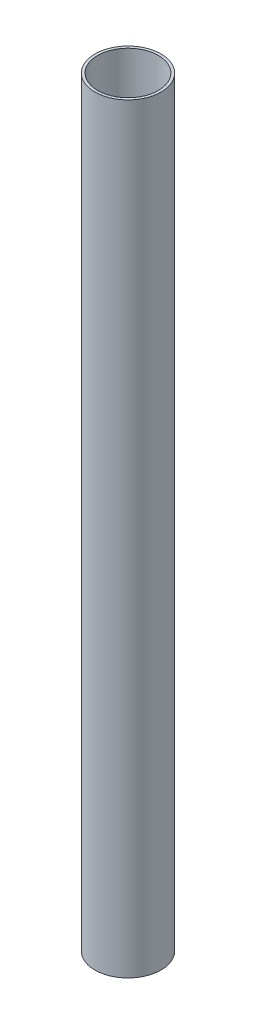
ISO-10303-21;
HEADER;
FILE_DESCRIPTION(('STEP AP214'),'2;1');
FILE_NAME('part.step','',(''),(''),'','','');
FILE_SCHEMA(('AUTOMOTIVE_DESIGN { 1 0 10303 214 1 1 1 1 }'));
ENDSEC;
DATA;
#1=APPLICATION_CONTEXT('core data for automotive mechanical design processes');
#2=APPLICATION_PROTOCOL_DEFINITION('international standard','automotive_design',2000,#1);
#3=PRODUCT_CONTEXT('',#1,'mechanical');
#4=PRODUCT('Part','Part','',(#3));
#5=PRODUCT_RELATED_PRODUCT_CATEGORY('part','',(#4));
#6=PRODUCT_DEFINITION_FORMATION('','',#4);
#7=PRODUCT_DEFINITION_CONTEXT('part definition',#1,'design');
#8=PRODUCT_DEFINITION('design','',#6,#7);
#9=PRODUCT_DEFINITION_SHAPE('','',#8);
#10=(LENGTH_UNIT() NAMED_UNIT(*) SI_UNIT(.MILLI.,.METRE.));
#11=(NAMED_UNIT(*) PLANE_ANGLE_UNIT() SI_UNIT($,.RADIAN.));
#12=(NAMED_UNIT(*) SI_UNIT($,.STERADIAN.) SOLID_ANGLE_UNIT());
#13=UNCERTAINTY_MEASURE_WITH_UNIT(LENGTH_MEASURE(1.E-05),#10,'distance_accuracy_value','');
#14=(GEOMETRIC_REPRESENTATION_CONTEXT(3) GLOBAL_UNCERTAINTY_ASSIGNED_CONTEXT((#13)) GLOBAL_UNIT_ASSIGNED_CONTEXT((#10,
#11,#12)) REPRESENTATION_CONTEXT('',''));
#15=CARTESIAN_POINT('',(0.,0.,0.));
#16=DIRECTION('',(0.,0.,1.));
#17=DIRECTION('',(1.,0.,0.));
#18=AXIS2_PLACEMENT_3D('',#15,#16,#17);
#19=CARTESIAN_POINT('',(0.,14.27,0.));
#20=DIRECTION('',(0.,1.,0.));
#21=DIRECTION('',(0.,0.,1.));
#22=AXIS2_PLACEMENT_3D('',#19,#20,#21);
#23=PLANE('',#22);
#24=CARTESIAN_POINT('',(0.,14.27,0.));
#25=DIRECTION('',(0.,1.,0.));
#26=DIRECTION('',(0.,0.,1.));
#27=AXIS2_PLACEMENT_3D('',#24,#25,#26);
#28=CIRCLE('',#27,0.620000000000001);
#29=CARTESIAN_POINT('',(0.,14.27,0.620000000000001));
#30=VERTEX_POINT('',#29);
#31=EDGE_CURVE('E10',#30,#30,#28,.T.);
#32=ORIENTED_EDGE('',*,*,#31,.T.);
#33=EDGE_LOOP('',(#32));
#34=FACE_BOUND('',#33,.T.);
#35=CARTESIAN_POINT('',(0.,14.27,0.));
#36=DIRECTION('',(0.,1.,0.));
#37=DIRECTION('',(0.,0.,1.));
#38=AXIS2_PLACEMENT_3D('',#35,#36,#37);
#39=CIRCLE('',#38,0.57);
#40=CARTESIAN_POINT('',(0.,14.27,0.57));
#41=VERTEX_POINT('',#40);
#42=EDGE_CURVE('E43',#41,#41,#39,.T.);
#43=ORIENTED_EDGE('',*,*,#42,.F.);
#44=EDGE_LOOP('',(#43));
#45=FACE_BOUND('',#44,.T.);
#46=ADVANCED_FACE('F32',(#34,#45),#23,.T.);
#47=CARTESIAN_POINT('',(0.,0.,0.));
#48=DIRECTION('',(0.,1.,0.));
#49=DIRECTION('',(0.,0.,1.));
#50=AXIS2_PLACEMENT_3D('',#47,#48,#49);
#51=PLANE('',#50);
#52=CARTESIAN_POINT('',(0.,0.,0.));
#53=DIRECTION('',(0.,1.,0.));
#54=DIRECTION('',(0.,0.,1.));
#55=AXIS2_PLACEMENT_3D('',#52,#53,#54);
#56=CIRCLE('',#55,0.620000000000001);
#57=CARTESIAN_POINT('',(0.,0.,0.620000000000001));
#58=VERTEX_POINT('',#57);
#59=EDGE_CURVE('E36',#58,#58,#56,.T.);
#60=ORIENTED_EDGE('',*,*,#59,.F.);
#61=EDGE_LOOP('',(#60));
#62=FACE_BOUND('',#61,.T.);
#63=CARTESIAN_POINT('',(0.,0.,0.));
#64=DIRECTION('',(0.,1.,0.));
#65=DIRECTION('',(0.,0.,1.));
#66=AXIS2_PLACEMENT_3D('',#63,#64,#65);
#67=CIRCLE('',#66,0.57);
#68=CARTESIAN_POINT('',(0.,0.,0.57));
#69=VERTEX_POINT('',#68);
#70=EDGE_CURVE('E45',#69,#69,#67,.T.);
#71=ORIENTED_EDGE('',*,*,#70,.T.);
#72=EDGE_LOOP('',(#71));
#73=FACE_BOUND('',#72,.T.);
#74=ADVANCED_FACE('F55',(#62,#73),#51,.F.);
#75=CARTESIAN_POINT('',(0.,14.27,0.));
#76=DIRECTION('',(0.,-1.,0.));
#77=DIRECTION('',(0.,0.,-1.));
#78=AXIS2_PLACEMENT_3D('',#75,#76,#77);
#79=CYLINDRICAL_SURFACE('',#78,0.620000000000001);
#80=ORIENTED_EDGE('',*,*,#31,.F.);
#81=EDGE_LOOP('',(#80));
#82=FACE_BOUND('',#81,.T.);
#83=ORIENTED_EDGE('',*,*,#59,.T.);
#84=EDGE_LOOP('',(#83));
#85=FACE_BOUND('',#84,.T.);
#86=ADVANCED_FACE('F34',(#82,#85),#79,.T.);
#87=CARTESIAN_POINT('',(0.,14.27,0.));
#88=DIRECTION('',(0.,-1.,0.));
#89=DIRECTION('',(0.,0.,-1.));
#90=AXIS2_PLACEMENT_3D('',#87,#88,#89);
#91=CYLINDRICAL_SURFACE('',#90,0.57);
#92=ORIENTED_EDGE('',*,*,#42,.T.);
#93=EDGE_LOOP('',(#92));
#94=FACE_BOUND('',#93,.T.);
#95=ORIENTED_EDGE('',*,*,#70,.F.);
#96=EDGE_LOOP('',(#95));
#97=FACE_BOUND('',#96,.T.);
#98=ADVANCED_FACE('F51',(#94,#97),#91,.F.);
#99=CLOSED_SHELL('',(#46,#74,#86,#98));
#100=MANIFOLD_SOLID_BREP('B2',#99);
#101=ADVANCED_BREP_SHAPE_REPRESENTATION('',(#18,#100),#14);
#102=SHAPE_DEFINITION_REPRESENTATION(#9,#101);
ENDSEC;
END-ISO-10303-21;
